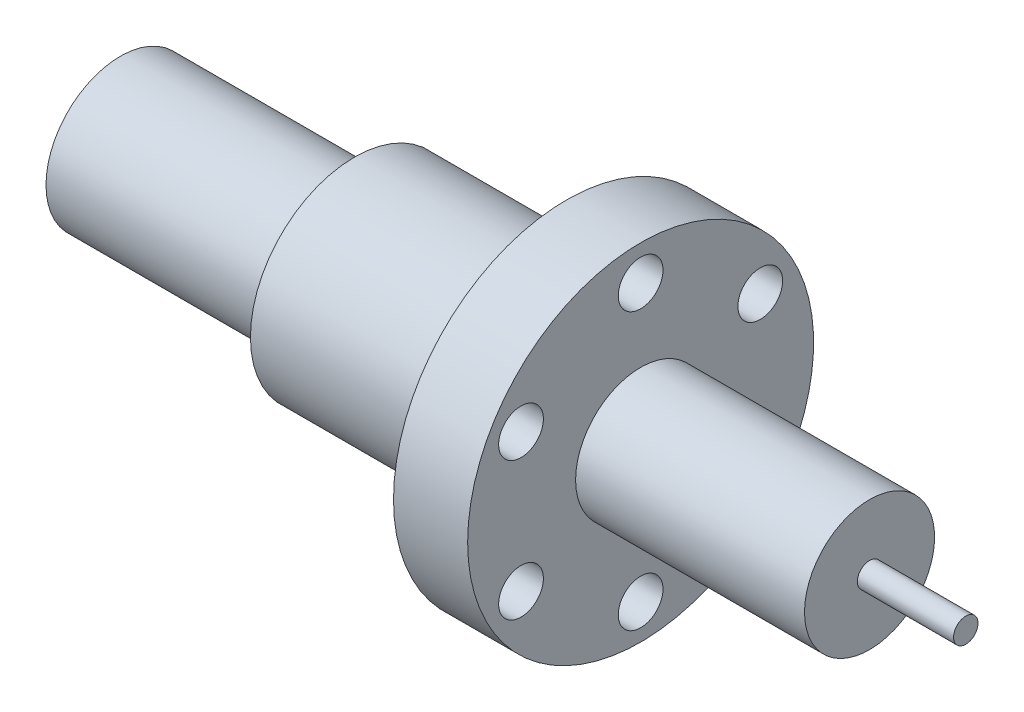
ISO-10303-21;
HEADER;
FILE_DESCRIPTION(('STEP AP214'),'2;1');
FILE_NAME('part.step','',(''),(''),'','','');
FILE_SCHEMA(('AUTOMOTIVE_DESIGN { 1 0 10303 214 1 1 1 1 }'));
ENDSEC;
DATA;
#1=APPLICATION_CONTEXT('core data for automotive mechanical design processes');
#2=APPLICATION_PROTOCOL_DEFINITION('international standard','automotive_design',2000,#1);
#3=PRODUCT_CONTEXT('',#1,'mechanical');
#4=PRODUCT('Part','Part','',(#3));
#5=PRODUCT_RELATED_PRODUCT_CATEGORY('part','',(#4));
#6=PRODUCT_DEFINITION_FORMATION('','',#4);
#7=PRODUCT_DEFINITION_CONTEXT('part definition',#1,'design');
#8=PRODUCT_DEFINITION('design','',#6,#7);
#9=PRODUCT_DEFINITION_SHAPE('','',#8);
#10=(LENGTH_UNIT() NAMED_UNIT(*) SI_UNIT(.MILLI.,.METRE.));
#11=(NAMED_UNIT(*) PLANE_ANGLE_UNIT() SI_UNIT($,.RADIAN.));
#12=(NAMED_UNIT(*) SI_UNIT($,.STERADIAN.) SOLID_ANGLE_UNIT());
#13=UNCERTAINTY_MEASURE_WITH_UNIT(LENGTH_MEASURE(1.E-05),#10,'distance_accuracy_value','');
#14=(GEOMETRIC_REPRESENTATION_CONTEXT(3) GLOBAL_UNCERTAINTY_ASSIGNED_CONTEXT((#13)) GLOBAL_UNIT_ASSIGNED_CONTEXT((#10,
#11,#12)) REPRESENTATION_CONTEXT('',''));
#15=CARTESIAN_POINT('',(0.,0.,0.));
#16=DIRECTION('',(0.,0.,1.));
#17=DIRECTION('',(1.,0.,0.));
#18=AXIS2_PLACEMENT_3D('',#15,#16,#17);
#19=CARTESIAN_POINT('',(-40.72842674349,0.,0.));
#20=DIRECTION('',(-1.,0.,0.));
#21=DIRECTION('',(0.,0.,1.));
#22=AXIS2_PLACEMENT_3D('',#19,#20,#21);
#23=CYLINDRICAL_SURFACE('',#22,10.16);
#24=CARTESIAN_POINT('',(-7.239,0.,0.));
#25=DIRECTION('',(-1.,0.,0.));
#26=DIRECTION('',(0.,0.,1.));
#27=AXIS2_PLACEMENT_3D('',#24,#25,#26);
#28=CIRCLE('',#27,10.16);
#29=CARTESIAN_POINT('',(-7.239,0.,10.16));
#30=VERTEX_POINT('',#29);
#31=EDGE_CURVE('E48',#30,#30,#28,.T.);
#32=ORIENTED_EDGE('',*,*,#31,.T.);
#33=EDGE_LOOP('',(#32));
#34=FACE_BOUND('',#33,.T.);
#35=CARTESIAN_POINT('',(-27.94,0.,0.));
#36=DIRECTION('',(-1.,0.,0.));
#37=DIRECTION('',(0.,0.,1.));
#38=AXIS2_PLACEMENT_3D('',#35,#36,#37);
#39=CIRCLE('',#38,10.1600000000001);
#40=CARTESIAN_POINT('',(-27.94,0.,10.1600000000001));
#41=VERTEX_POINT('',#40);
#42=EDGE_CURVE('E273',#41,#41,#39,.T.);
#43=ORIENTED_EDGE('',*,*,#42,.F.);
#44=EDGE_LOOP('',(#43));
#45=FACE_BOUND('',#44,.T.);
#46=ADVANCED_FACE('F28',(#34,#45),#23,.T.);
#47=CARTESIAN_POINT('',(31.75,0.,0.));
#48=DIRECTION('',(-1.,0.,0.));
#49=DIRECTION('',(0.,0.,1.));
#50=AXIS2_PLACEMENT_3D('',#47,#48,#49);
#51=PLANE('',#50);
#52=CARTESIAN_POINT('',(31.75,0.,0.));
#53=DIRECTION('',(-1.,0.,0.));
#54=DIRECTION('',(0.,0.,1.));
#55=AXIS2_PLACEMENT_3D('',#52,#53,#54);
#56=CIRCLE('',#55,1.1938);
#57=CARTESIAN_POINT('',(31.75,0.,1.1938));
#58=VERTEX_POINT('',#57);
#59=EDGE_CURVE('E10',#58,#58,#56,.T.);
#60=ORIENTED_EDGE('',*,*,#59,.F.);
#61=EDGE_LOOP('',(#60));
#62=FACE_BOUND('',#61,.T.);
#63=ADVANCED_FACE('F30',(#62),#51,.F.);
#64=CARTESIAN_POINT('',(-40.72842674349,0.,0.));
#65=DIRECTION('',(-1.,0.,0.));
#66=DIRECTION('',(0.,0.,1.));
#67=AXIS2_PLACEMENT_3D('',#64,#65,#66);
#68=CYLINDRICAL_SURFACE('',#67,1.1938);
#69=CARTESIAN_POINT('',(22.352,0.,0.));
#70=DIRECTION('',(-1.,0.,0.));
#71=DIRECTION('',(0.,0.,1.));
#72=AXIS2_PLACEMENT_3D('',#69,#70,#71);
#73=CIRCLE('',#72,1.1938);
#74=CARTESIAN_POINT('',(22.352,0.,1.1938));
#75=VERTEX_POINT('',#74);
#76=EDGE_CURVE('E36',#75,#75,#73,.T.);
#77=ORIENTED_EDGE('',*,*,#76,.F.);
#78=EDGE_LOOP('',(#77));
#79=FACE_BOUND('',#78,.T.);
#80=ORIENTED_EDGE('',*,*,#59,.T.);
#81=EDGE_LOOP('',(#80));
#82=FACE_BOUND('',#81,.T.);
#83=ADVANCED_FACE('F101',(#79,#82),#68,.T.);
#84=CARTESIAN_POINT('',(22.352,1.1938,0.));
#85=DIRECTION('',(-1.,0.,0.));
#86=DIRECTION('',(0.,0.,1.));
#87=AXIS2_PLACEMENT_3D('',#84,#85,#86);
#88=PLANE('',#87);
#89=CARTESIAN_POINT('',(22.352,0.,0.));
#90=DIRECTION('',(-1.,0.,0.));
#91=DIRECTION('',(0.,0.,1.));
#92=AXIS2_PLACEMENT_3D('',#89,#90,#91);
#93=CIRCLE('',#92,6.35);
#94=CARTESIAN_POINT('',(22.352,0.,6.35));
#95=VERTEX_POINT('',#94);
#96=EDGE_CURVE('E41',#95,#95,#93,.T.);
#97=ORIENTED_EDGE('',*,*,#96,.F.);
#98=EDGE_LOOP('',(#97));
#99=FACE_BOUND('',#98,.T.);
#100=ORIENTED_EDGE('',*,*,#76,.T.);
#101=EDGE_LOOP('',(#100));
#102=FACE_BOUND('',#101,.T.);
#103=ADVANCED_FACE('F98',(#99,#102),#88,.F.);
#104=CARTESIAN_POINT('',(-40.72842674349,0.,0.));
#105=DIRECTION('',(-1.,0.,0.));
#106=DIRECTION('',(0.,0.,1.));
#107=AXIS2_PLACEMENT_3D('',#104,#105,#106);
#108=CYLINDRICAL_SURFACE('',#107,6.35);
#109=CARTESIAN_POINT('',(0.,0.,0.));
#110=DIRECTION('',(-1.,0.,0.));
#111=DIRECTION('',(0.,0.,1.));
#112=AXIS2_PLACEMENT_3D('',#109,#110,#111);
#113=CIRCLE('',#112,6.35);
#114=CARTESIAN_POINT('',(0.,0.,6.35));
#115=VERTEX_POINT('',#114);
#116=EDGE_CURVE('E91',#115,#115,#113,.T.);
#117=ORIENTED_EDGE('',*,*,#116,.F.);
#118=EDGE_LOOP('',(#117));
#119=FACE_BOUND('',#118,.T.);
#120=ORIENTED_EDGE('',*,*,#96,.T.);
#121=EDGE_LOOP('',(#120));
#122=FACE_BOUND('',#121,.T.);
#123=ADVANCED_FACE('F96',(#119,#122),#108,.T.);
#124=CARTESIAN_POINT('',(0.,6.35,0.));
#125=DIRECTION('',(-1.,0.,0.));
#126=DIRECTION('',(0.,0.,1.));
#127=AXIS2_PLACEMENT_3D('',#124,#125,#126);
#128=PLANE('',#127);
#129=CARTESIAN_POINT('',(0.,6.74370000000014,11.6804310310022));
#130=DIRECTION('',(1.,0.,0.));
#131=DIRECTION('',(0.,0.866025403784433,-0.50000000000001));
#132=AXIS2_PLACEMENT_3D('',#129,#130,#131);
#133=CIRCLE('',#132,2.1844);
#134=CARTESIAN_POINT('',(0.,8.63544589202685,10.5882310310021));
#135=VERTEX_POINT('',#134);
#136=EDGE_CURVE('E73',#135,#135,#133,.T.);
#137=ORIENTED_EDGE('',*,*,#136,.F.);
#138=EDGE_LOOP('',(#137));
#139=FACE_BOUND('',#138,.T.);
#140=CARTESIAN_POINT('',(0.,-6.74369999999989,11.6804310310023));
#141=DIRECTION('',(1.,0.,0.));
#142=DIRECTION('',(0.,0.866025403784443,0.499999999999992));
#143=AXIS2_PLACEMENT_3D('',#140,#141,#142);
#144=CIRCLE('',#143,2.1844);
#145=CARTESIAN_POINT('',(0.,-4.85195410797315,12.7726310310023));
#146=VERTEX_POINT('',#145);
#147=EDGE_CURVE('E63',#146,#146,#144,.T.);
#148=ORIENTED_EDGE('',*,*,#147,.F.);
#149=EDGE_LOOP('',(#148));
#150=FACE_BOUND('',#149,.T.);
#151=CARTESIAN_POINT('',(0.,-13.4874,0.));
#152=DIRECTION('',(1.,0.,0.));
#153=DIRECTION('',(0.,0.,1.));
#154=AXIS2_PLACEMENT_3D('',#151,#152,#153);
#155=CIRCLE('',#154,2.1844);
#156=CARTESIAN_POINT('',(0.,-13.4874,2.18440000000009));
#157=VERTEX_POINT('',#156);
#158=EDGE_CURVE('E60',#157,#157,#155,.T.);
#159=ORIENTED_EDGE('',*,*,#158,.F.);
#160=EDGE_LOOP('',(#159));
#161=FACE_BOUND('',#160,.T.);
#162=CARTESIAN_POINT('',(0.,-6.74370000000006,-11.6804310310022));
#163=DIRECTION('',(1.,0.,0.));
#164=DIRECTION('',(0.,-0.866025403784436,0.500000000000004));
#165=AXIS2_PLACEMENT_3D('',#162,#163,#164);
#166=CIRCLE('',#165,2.1844);
#167=CARTESIAN_POINT('',(0.,-8.63544589202678,-10.5882310310022));
#168=VERTEX_POINT('',#167);
#169=EDGE_CURVE('E57',#168,#168,#166,.T.);
#170=ORIENTED_EDGE('',*,*,#169,.F.);
#171=EDGE_LOOP('',(#170));
#172=FACE_BOUND('',#171,.T.);
#173=CARTESIAN_POINT('',(0.,6.74369999999997,-11.6804310310023));
#174=DIRECTION('',(1.,0.,0.));
#175=DIRECTION('',(0.,-0.86602540378444,-0.499999999999998));
#176=AXIS2_PLACEMENT_3D('',#173,#174,#175);
#177=CIRCLE('',#176,2.1844);
#178=CARTESIAN_POINT('',(0.,4.85195410797324,-12.7726310310023));
#179=VERTEX_POINT('',#178);
#180=EDGE_CURVE('E53',#179,#179,#177,.T.);
#181=ORIENTED_EDGE('',*,*,#180,.F.);
#182=EDGE_LOOP('',(#181));
#183=FACE_BOUND('',#182,.T.);
#184=CARTESIAN_POINT('',(0.,13.4874,0.));
#185=DIRECTION('',(1.,0.,0.));
#186=DIRECTION('',(0.,0.,-1.));
#187=AXIS2_PLACEMENT_3D('',#184,#185,#186);
#188=CIRCLE('',#187,2.1844);
#189=CARTESIAN_POINT('',(0.,13.4874,-2.1844));
#190=VERTEX_POINT('',#189);
#191=EDGE_CURVE('E49',#190,#190,#188,.T.);
#192=ORIENTED_EDGE('',*,*,#191,.F.);
#193=EDGE_LOOP('',(#192));
#194=FACE_BOUND('',#193,.T.);
#195=CARTESIAN_POINT('',(0.,0.,0.));
#196=DIRECTION('',(-1.,0.,0.));
#197=DIRECTION('',(0.,0.,1.));
#198=AXIS2_PLACEMENT_3D('',#195,#196,#197);
#199=CIRCLE('',#198,16.891);
#200=CARTESIAN_POINT('',(0.,0.,16.891));
#201=VERTEX_POINT('',#200);
#202=EDGE_CURVE('E88',#201,#201,#199,.T.);
#203=ORIENTED_EDGE('',*,*,#202,.F.);
#204=EDGE_LOOP('',(#203));
#205=FACE_BOUND('',#204,.T.);
#206=ORIENTED_EDGE('',*,*,#116,.T.);
#207=EDGE_LOOP('',(#206));
#208=FACE_BOUND('',#207,.T.);
#209=ADVANCED_FACE('F128',(#139,#150,#161,#172,#183,#194,#205,#208),#128,.F.);
#210=CARTESIAN_POINT('',(-40.72842674349,0.,0.));
#211=DIRECTION('',(-1.,0.,0.));
#212=DIRECTION('',(0.,0.,1.));
#213=AXIS2_PLACEMENT_3D('',#210,#211,#212);
#214=CYLINDRICAL_SURFACE('',#213,16.891);
#215=CARTESIAN_POINT('',(-7.239,0.,0.));
#216=DIRECTION('',(-1.,0.,0.));
#217=DIRECTION('',(0.,0.,1.));
#218=AXIS2_PLACEMENT_3D('',#215,#216,#217);
#219=CIRCLE('',#218,16.891);
#220=CARTESIAN_POINT('',(-7.239,0.,16.891));
#221=VERTEX_POINT('',#220);
#222=EDGE_CURVE('E85',#221,#221,#219,.T.);
#223=ORIENTED_EDGE('',*,*,#222,.F.);
#224=EDGE_LOOP('',(#223));
#225=FACE_BOUND('',#224,.T.);
#226=ORIENTED_EDGE('',*,*,#202,.T.);
#227=EDGE_LOOP('',(#226));
#228=FACE_BOUND('',#227,.T.);
#229=ADVANCED_FACE('F124',(#225,#228),#214,.T.);
#230=CARTESIAN_POINT('',(-7.239,16.891,0.));
#231=DIRECTION('',(1.,0.,0.));
#232=DIRECTION('',(0.,0.,-1.));
#233=AXIS2_PLACEMENT_3D('',#230,#231,#232);
#234=PLANE('',#233);
#235=CARTESIAN_POINT('',(-7.239,6.74370000000014,11.6804310310022));
#236=DIRECTION('',(1.,0.,0.));
#237=DIRECTION('',(0.,0.,-1.));
#238=AXIS2_PLACEMENT_3D('',#235,#236,#237);
#239=CIRCLE('',#238,2.1844);
#240=CARTESIAN_POINT('',(-7.239,6.74370000000014,9.49603103100216));
#241=VERTEX_POINT('',#240);
#242=EDGE_CURVE('E32',#241,#241,#239,.T.);
#243=ORIENTED_EDGE('',*,*,#242,.T.);
#244=EDGE_LOOP('',(#243));
#245=FACE_BOUND('',#244,.T.);
#246=CARTESIAN_POINT('',(-7.239,-6.74369999999989,11.6804310310023));
#247=DIRECTION('',(1.,0.,0.));
#248=DIRECTION('',(0.,0.,-1.));
#249=AXIS2_PLACEMENT_3D('',#246,#247,#248);
#250=CIRCLE('',#249,2.1844);
#251=CARTESIAN_POINT('',(-7.239,-6.74369999999989,9.4960310310023));
#252=VERTEX_POINT('',#251);
#253=EDGE_CURVE('E61',#252,#252,#250,.T.);
#254=ORIENTED_EDGE('',*,*,#253,.T.);
#255=EDGE_LOOP('',(#254));
#256=FACE_BOUND('',#255,.T.);
#257=CARTESIAN_POINT('',(-7.239,-13.4874,0.));
#258=DIRECTION('',(1.,0.,0.));
#259=DIRECTION('',(0.,0.,-1.));
#260=AXIS2_PLACEMENT_3D('',#257,#258,#259);
#261=CIRCLE('',#260,2.1844);
#262=CARTESIAN_POINT('',(-7.239,-13.4874,-2.18439999999991));
#263=VERTEX_POINT('',#262);
#264=EDGE_CURVE('E58',#263,#263,#261,.T.);
#265=ORIENTED_EDGE('',*,*,#264,.T.);
#266=EDGE_LOOP('',(#265));
#267=FACE_BOUND('',#266,.T.);
#268=CARTESIAN_POINT('',(-7.239,-6.74370000000006,-11.6804310310022));
#269=DIRECTION('',(1.,0.,0.));
#270=DIRECTION('',(0.,0.,-1.));
#271=AXIS2_PLACEMENT_3D('',#268,#269,#270);
#272=CIRCLE('',#271,2.1844);
#273=CARTESIAN_POINT('',(-7.239,-6.74370000000006,-13.8648310310022));
#274=VERTEX_POINT('',#273);
#275=EDGE_CURVE('E54',#274,#274,#272,.T.);
#276=ORIENTED_EDGE('',*,*,#275,.T.);
#277=EDGE_LOOP('',(#276));
#278=FACE_BOUND('',#277,.T.);
#279=CARTESIAN_POINT('',(-7.239,6.74369999999997,-11.6804310310023));
#280=DIRECTION('',(1.,0.,0.));
#281=DIRECTION('',(0.,0.,-1.));
#282=AXIS2_PLACEMENT_3D('',#279,#280,#281);
#283=CIRCLE('',#282,2.1844);
#284=CARTESIAN_POINT('',(-7.239,6.74369999999997,-13.8648310310023));
#285=VERTEX_POINT('',#284);
#286=EDGE_CURVE('E50',#285,#285,#283,.T.);
#287=ORIENTED_EDGE('',*,*,#286,.T.);
#288=EDGE_LOOP('',(#287));
#289=FACE_BOUND('',#288,.T.);
#290=CARTESIAN_POINT('',(-7.239,13.4874,0.));
#291=DIRECTION('',(1.,0.,0.));
#292=DIRECTION('',(0.,0.,-1.));
#293=AXIS2_PLACEMENT_3D('',#290,#291,#292);
#294=CIRCLE('',#293,2.1844);
#295=CARTESIAN_POINT('',(-7.239,13.4874,-2.1844));
#296=VERTEX_POINT('',#295);
#297=EDGE_CURVE('E45',#296,#296,#294,.T.);
#298=ORIENTED_EDGE('',*,*,#297,.T.);
#299=EDGE_LOOP('',(#298));
#300=FACE_BOUND('',#299,.T.);
#301=ORIENTED_EDGE('',*,*,#31,.F.);
#302=EDGE_LOOP('',(#301));
#303=FACE_BOUND('',#302,.T.);
#304=ORIENTED_EDGE('',*,*,#222,.T.);
#305=EDGE_LOOP('',(#304));
#306=FACE_BOUND('',#305,.T.);
#307=ADVANCED_FACE('F120',(#245,#256,#267,#278,#289,#300,#303,#306),#234,.F.);
#308=CARTESIAN_POINT('',(-50.8,13.4874,0.));
#309=DIRECTION('',(1.,0.,0.));
#310=DIRECTION('',(0.,0.,-1.));
#311=AXIS2_PLACEMENT_3D('',#308,#309,#310);
#312=CYLINDRICAL_SURFACE('',#311,2.1844);
#313=ORIENTED_EDGE('',*,*,#191,.T.);
#314=EDGE_LOOP('',(#313));
#315=FACE_BOUND('',#314,.T.);
#316=ORIENTED_EDGE('',*,*,#297,.F.);
#317=EDGE_LOOP('',(#316));
#318=FACE_BOUND('',#317,.T.);
#319=ADVANCED_FACE('F123',(#315,#318),#312,.F.);
#320=CARTESIAN_POINT('',(-50.8,6.74369999999997,-11.6804310310023));
#321=DIRECTION('',(1.,0.,0.));
#322=DIRECTION('',(0.,0.,-1.));
#323=AXIS2_PLACEMENT_3D('',#320,#321,#322);
#324=CYLINDRICAL_SURFACE('',#323,2.1844);
#325=ORIENTED_EDGE('',*,*,#180,.T.);
#326=EDGE_LOOP('',(#325));
#327=FACE_BOUND('',#326,.T.);
#328=ORIENTED_EDGE('',*,*,#286,.F.);
#329=EDGE_LOOP('',(#328));
#330=FACE_BOUND('',#329,.T.);
#331=ADVANCED_FACE('F160',(#327,#330),#324,.F.);
#332=CARTESIAN_POINT('',(-50.8,-6.74370000000006,-11.6804310310022));
#333=DIRECTION('',(1.,0.,0.));
#334=DIRECTION('',(0.,0.,-1.));
#335=AXIS2_PLACEMENT_3D('',#332,#333,#334);
#336=CYLINDRICAL_SURFACE('',#335,2.1844);
#337=ORIENTED_EDGE('',*,*,#169,.T.);
#338=EDGE_LOOP('',(#337));
#339=FACE_BOUND('',#338,.T.);
#340=ORIENTED_EDGE('',*,*,#275,.F.);
#341=EDGE_LOOP('',(#340));
#342=FACE_BOUND('',#341,.T.);
#343=ADVANCED_FACE('F166',(#339,#342),#336,.F.);
#344=CARTESIAN_POINT('',(-50.8,-13.4874,0.));
#345=DIRECTION('',(1.,0.,0.));
#346=DIRECTION('',(0.,0.,-1.));
#347=AXIS2_PLACEMENT_3D('',#344,#345,#346);
#348=CYLINDRICAL_SURFACE('',#347,2.1844);
#349=ORIENTED_EDGE('',*,*,#158,.T.);
#350=EDGE_LOOP('',(#349));
#351=FACE_BOUND('',#350,.T.);
#352=ORIENTED_EDGE('',*,*,#264,.F.);
#353=EDGE_LOOP('',(#352));
#354=FACE_BOUND('',#353,.T.);
#355=ADVANCED_FACE('F174',(#351,#354),#348,.F.);
#356=CARTESIAN_POINT('',(-50.8,-6.74369999999989,11.6804310310023));
#357=DIRECTION('',(1.,0.,0.));
#358=DIRECTION('',(0.,0.,-1.));
#359=AXIS2_PLACEMENT_3D('',#356,#357,#358);
#360=CYLINDRICAL_SURFACE('',#359,2.1844);
#361=ORIENTED_EDGE('',*,*,#147,.T.);
#362=EDGE_LOOP('',(#361));
#363=FACE_BOUND('',#362,.T.);
#364=ORIENTED_EDGE('',*,*,#253,.F.);
#365=EDGE_LOOP('',(#364));
#366=FACE_BOUND('',#365,.T.);
#367=ADVANCED_FACE('F182',(#363,#366),#360,.F.);
#368=CARTESIAN_POINT('',(-50.8,6.74370000000014,11.6804310310022));
#369=DIRECTION('',(1.,0.,0.));
#370=DIRECTION('',(0.,0.,-1.));
#371=AXIS2_PLACEMENT_3D('',#368,#369,#370);
#372=CYLINDRICAL_SURFACE('',#371,2.1844);
#373=ORIENTED_EDGE('',*,*,#136,.T.);
#374=EDGE_LOOP('',(#373));
#375=FACE_BOUND('',#374,.T.);
#376=ORIENTED_EDGE('',*,*,#242,.F.);
#377=EDGE_LOOP('',(#376));
#378=FACE_BOUND('',#377,.T.);
#379=ADVANCED_FACE('F190',(#375,#378),#372,.F.);
#380=CARTESIAN_POINT('',(-27.94,0.,0.));
#381=DIRECTION('',(-1.,0.,0.));
#382=DIRECTION('',(0.,0.,1.));
#383=AXIS2_PLACEMENT_3D('',#380,#381,#382);
#384=PLANE('',#383);
#385=CARTESIAN_POINT('',(-27.94,0.,0.));
#386=DIRECTION('',(-1.,0.,0.));
#387=DIRECTION('',(0.,0.,1.));
#388=AXIS2_PLACEMENT_3D('',#385,#386,#387);
#389=CIRCLE('',#388,7.26109503058397);
#390=CARTESIAN_POINT('',(-27.94,0.,7.26109503058397));
#391=VERTEX_POINT('',#390);
#392=EDGE_CURVE('E270',#391,#391,#389,.T.);
#393=ORIENTED_EDGE('',*,*,#392,.F.);
#394=EDGE_LOOP('',(#393));
#395=FACE_BOUND('',#394,.T.);
#396=ORIENTED_EDGE('',*,*,#42,.T.);
#397=EDGE_LOOP('',(#396));
#398=FACE_BOUND('',#397,.T.);
#399=ADVANCED_FACE('F197',(#395,#398),#384,.T.);
#400=CARTESIAN_POINT('',(-27.94,0.,0.));
#401=DIRECTION('',(-1.,0.,0.));
#402=DIRECTION('',(0.,0.,1.));
#403=AXIS2_PLACEMENT_3D('',#400,#401,#402);
#404=CYLINDRICAL_SURFACE('',#403,7.26109503058397);
#405=ORIENTED_EDGE('',*,*,#392,.T.);
#406=EDGE_LOOP('',(#405));
#407=FACE_BOUND('',#406,.T.);
#408=CARTESIAN_POINT('',(-50.8,0.,0.));
#409=DIRECTION('',(-1.,0.,0.));
#410=DIRECTION('',(0.,0.,1.));
#411=AXIS2_PLACEMENT_3D('',#408,#409,#410);
#412=CIRCLE('',#411,7.26109503058397);
#413=CARTESIAN_POINT('',(-50.8,0.,7.26109503058397));
#414=VERTEX_POINT('',#413);
#415=EDGE_CURVE('E268',#414,#414,#412,.T.);
#416=ORIENTED_EDGE('',*,*,#415,.F.);
#417=EDGE_LOOP('',(#416));
#418=FACE_BOUND('',#417,.T.);
#419=ADVANCED_FACE('F205',(#407,#418),#404,.T.);
#420=CARTESIAN_POINT('',(-50.8,10.16,0.));
#421=DIRECTION('',(1.,0.,0.));
#422=DIRECTION('',(0.,0.,-1.));
#423=AXIS2_PLACEMENT_3D('',#420,#421,#422);
#424=PLANE('',#423);
#425=ORIENTED_EDGE('',*,*,#415,.T.);
#426=EDGE_LOOP('',(#425));
#427=FACE_BOUND('',#426,.T.);
#428=ADVANCED_FACE('F118',(#427),#424,.F.);
#429=CLOSED_SHELL('',(#46,#63,#83,#103,#123,#209,#229,#307,#319,#331,#343,#355,#367,#379,#399,
#419,#428));
#430=MANIFOLD_SOLID_BREP('B2',#429);
#431=ADVANCED_BREP_SHAPE_REPRESENTATION('',(#18,#430),#14);
#432=SHAPE_DEFINITION_REPRESENTATION(#9,#431);
ENDSEC;
END-ISO-10303-21;
